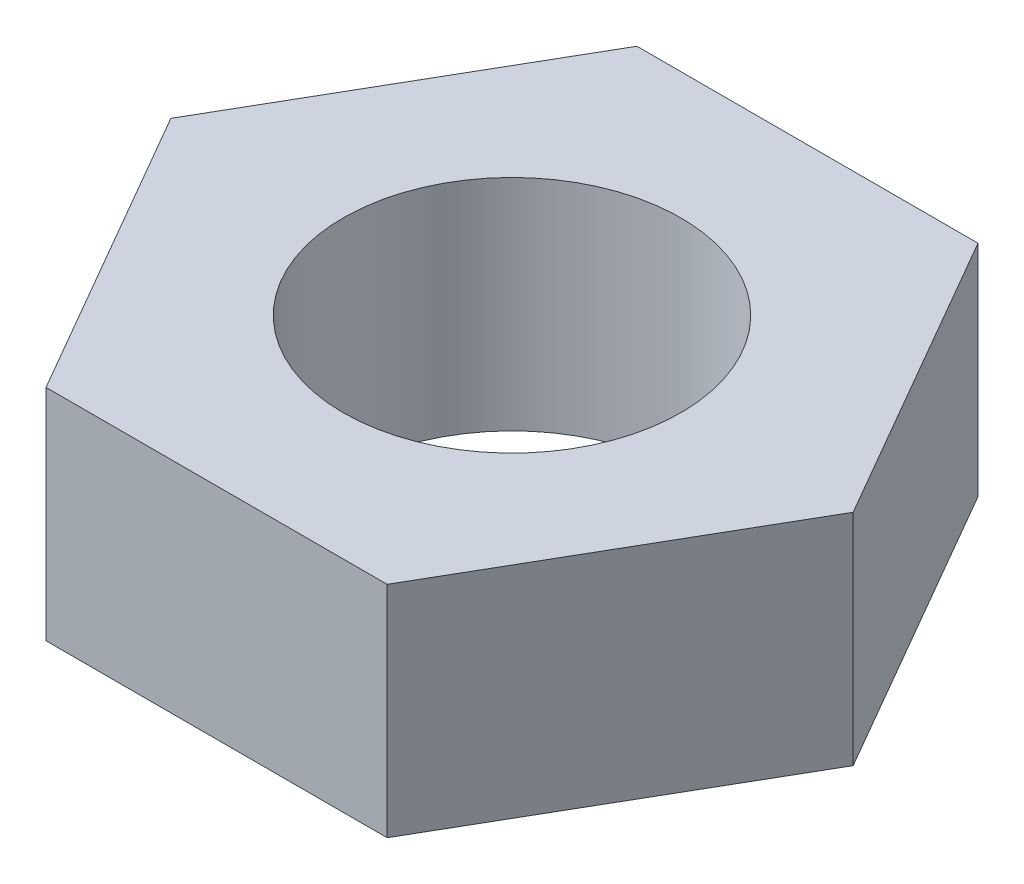
ISO-10303-21;
HEADER;
FILE_DESCRIPTION(('STEP AP214'),'2;1');
FILE_NAME('part.step','',(''),(''),'','','');
FILE_SCHEMA(('AUTOMOTIVE_DESIGN { 1 0 10303 214 1 1 1 1 }'));
ENDSEC;
DATA;
#1=APPLICATION_CONTEXT('core data for automotive mechanical design processes');
#2=APPLICATION_PROTOCOL_DEFINITION('international standard','automotive_design',2000,#1);
#3=PRODUCT_CONTEXT('',#1,'mechanical');
#4=PRODUCT('Part','Part','',(#3));
#5=PRODUCT_RELATED_PRODUCT_CATEGORY('part','',(#4));
#6=PRODUCT_DEFINITION_FORMATION('','',#4);
#7=PRODUCT_DEFINITION_CONTEXT('part definition',#1,'design');
#8=PRODUCT_DEFINITION('design','',#6,#7);
#9=PRODUCT_DEFINITION_SHAPE('','',#8);
#10=(LENGTH_UNIT() NAMED_UNIT(*) SI_UNIT(.MILLI.,.METRE.));
#11=(NAMED_UNIT(*) PLANE_ANGLE_UNIT() SI_UNIT($,.RADIAN.));
#12=(NAMED_UNIT(*) SI_UNIT($,.STERADIAN.) SOLID_ANGLE_UNIT());
#13=UNCERTAINTY_MEASURE_WITH_UNIT(LENGTH_MEASURE(1.E-05),#10,'distance_accuracy_value','');
#14=(GEOMETRIC_REPRESENTATION_CONTEXT(3) GLOBAL_UNCERTAINTY_ASSIGNED_CONTEXT((#13)) GLOBAL_UNIT_ASSIGNED_CONTEXT((#10,
#11,#12)) REPRESENTATION_CONTEXT('',''));
#15=CARTESIAN_POINT('',(0.,0.,0.));
#16=DIRECTION('',(0.,0.,1.));
#17=DIRECTION('',(1.,0.,0.));
#18=AXIS2_PLACEMENT_3D('',#15,#16,#17);
#19=CARTESIAN_POINT('',(0.,2.6,0.));
#20=DIRECTION('',(0.,1.,0.));
#21=DIRECTION('',(0.,0.,1.));
#22=AXIS2_PLACEMENT_3D('',#19,#20,#21);
#23=PLANE('',#22);
#24=DIRECTION('',(0.5,0.,-0.866025403784439));
#25=VECTOR('',#24,1.);
#26=CARTESIAN_POINT('',(2.02072594216369,2.6,3.5));
#27=LINE('',#26,#25);
#28=CARTESIAN_POINT('',(2.02072594216369,2.6,3.5));
#29=VERTEX_POINT('',#28);
#30=CARTESIAN_POINT('',(4.04145188432738,2.6,0.));
#31=VERTEX_POINT('',#30);
#32=EDGE_CURVE('E129',#29,#31,#27,.T.);
#33=ORIENTED_EDGE('',*,*,#32,.T.);
#34=DIRECTION('',(-0.5,0.,-0.866025403784439));
#35=VECTOR('',#34,1.);
#36=CARTESIAN_POINT('',(4.04145188432738,2.6,0.));
#37=LINE('',#36,#35);
#38=CARTESIAN_POINT('',(2.02072594216368,2.6,-3.50000000000001));
#39=VERTEX_POINT('',#38);
#40=EDGE_CURVE('E87',#31,#39,#37,.T.);
#41=ORIENTED_EDGE('',*,*,#40,.T.);
#42=DIRECTION('',(-1.,0.,0.));
#43=VECTOR('',#42,1.);
#44=CARTESIAN_POINT('',(2.02072594216368,2.6,-3.50000000000001));
#45=LINE('',#44,#43);
#46=CARTESIAN_POINT('',(-2.02072594216369,2.6,-3.50000000000001));
#47=VERTEX_POINT('',#46);
#48=EDGE_CURVE('E100',#39,#47,#45,.T.);
#49=ORIENTED_EDGE('',*,*,#48,.T.);
#50=DIRECTION('',(-0.5,0.,0.866025403784439));
#51=VECTOR('',#50,1.);
#52=CARTESIAN_POINT('',(-2.02072594216369,2.6,-3.50000000000001));
#53=LINE('',#52,#51);
#54=CARTESIAN_POINT('',(-4.04145188432739,2.6,0.));
#55=VERTEX_POINT('',#54);
#56=EDGE_CURVE('E94',#47,#55,#53,.T.);
#57=ORIENTED_EDGE('',*,*,#56,.T.);
#58=DIRECTION('',(0.5,0.,0.866025403784439));
#59=VECTOR('',#58,1.);
#60=CARTESIAN_POINT('',(-4.04145188432739,2.6,0.));
#61=LINE('',#60,#59);
#62=CARTESIAN_POINT('',(-2.02072594216369,2.6,3.5));
#63=VERTEX_POINT('',#62);
#64=EDGE_CURVE('E98',#55,#63,#61,.T.);
#65=ORIENTED_EDGE('',*,*,#64,.T.);
#66=DIRECTION('',(1.,0.,0.));
#67=VECTOR('',#66,1.);
#68=CARTESIAN_POINT('',(-2.02072594216369,2.6,3.5));
#69=LINE('',#68,#67);
#70=EDGE_CURVE('E50',#63,#29,#69,.T.);
#71=ORIENTED_EDGE('',*,*,#70,.T.);
#72=EDGE_LOOP('',(#33,#41,#49,#57,#65,#71));
#73=FACE_BOUND('',#72,.T.);
#74=CARTESIAN_POINT('',(0.,2.6,0.));
#75=DIRECTION('',(0.,1.,0.));
#76=DIRECTION('',(0.,0.,1.));
#77=AXIS2_PLACEMENT_3D('',#74,#75,#76);
#78=CIRCLE('',#77,2.);
#79=CARTESIAN_POINT('',(0.,2.6,2.));
#80=VERTEX_POINT('',#79);
#81=EDGE_CURVE('E122',#80,#80,#78,.T.);
#82=ORIENTED_EDGE('',*,*,#81,.F.);
#83=EDGE_LOOP('',(#82));
#84=FACE_BOUND('',#83,.T.);
#85=ADVANCED_FACE('F33',(#73,#84),#23,.T.);
#86=CARTESIAN_POINT('',(0.,0.,0.));
#87=DIRECTION('',(0.,1.,0.));
#88=DIRECTION('',(0.,0.,1.));
#89=AXIS2_PLACEMENT_3D('',#86,#87,#88);
#90=PLANE('',#89);
#91=DIRECTION('',(0.5,0.,-0.866025403784439));
#92=VECTOR('',#91,1.);
#93=CARTESIAN_POINT('',(2.02072594216369,0.,3.5));
#94=LINE('',#93,#92);
#95=CARTESIAN_POINT('',(2.02072594216369,0.,3.5));
#96=VERTEX_POINT('',#95);
#97=CARTESIAN_POINT('',(4.04145188432738,0.,0.));
#98=VERTEX_POINT('',#97);
#99=EDGE_CURVE('E118',#96,#98,#94,.T.);
#100=ORIENTED_EDGE('',*,*,#99,.F.);
#101=DIRECTION('',(1.,0.,0.));
#102=VECTOR('',#101,1.);
#103=CARTESIAN_POINT('',(-2.02072594216369,0.,3.5));
#104=LINE('',#103,#102);
#105=CARTESIAN_POINT('',(-2.02072594216369,0.,3.5));
#106=VERTEX_POINT('',#105);
#107=EDGE_CURVE('E79',#106,#96,#104,.T.);
#108=ORIENTED_EDGE('',*,*,#107,.F.);
#109=DIRECTION('',(0.5,0.,0.866025403784439));
#110=VECTOR('',#109,1.);
#111=CARTESIAN_POINT('',(-4.04145188432739,0.,0.));
#112=LINE('',#111,#110);
#113=CARTESIAN_POINT('',(-4.04145188432739,0.,0.));
#114=VERTEX_POINT('',#113);
#115=EDGE_CURVE('E73',#114,#106,#112,.T.);
#116=ORIENTED_EDGE('',*,*,#115,.F.);
#117=DIRECTION('',(-0.5,0.,0.866025403784439));
#118=VECTOR('',#117,1.);
#119=CARTESIAN_POINT('',(-2.02072594216369,0.,-3.50000000000001));
#120=LINE('',#119,#118);
#121=CARTESIAN_POINT('',(-2.02072594216369,0.,-3.50000000000001));
#122=VERTEX_POINT('',#121);
#123=EDGE_CURVE('E108',#122,#114,#120,.T.);
#124=ORIENTED_EDGE('',*,*,#123,.F.);
#125=DIRECTION('',(-1.,0.,0.));
#126=VECTOR('',#125,1.);
#127=CARTESIAN_POINT('',(2.02072594216368,0.,-3.50000000000001));
#128=LINE('',#127,#126);
#129=CARTESIAN_POINT('',(2.02072594216368,0.,-3.50000000000001));
#130=VERTEX_POINT('',#129);
#131=EDGE_CURVE('E124',#130,#122,#128,.T.);
#132=ORIENTED_EDGE('',*,*,#131,.F.);
#133=DIRECTION('',(-0.5,0.,-0.866025403784439));
#134=VECTOR('',#133,1.);
#135=CARTESIAN_POINT('',(4.04145188432738,0.,0.));
#136=LINE('',#135,#134);
#137=EDGE_CURVE('E121',#98,#130,#136,.T.);
#138=ORIENTED_EDGE('',*,*,#137,.F.);
#139=EDGE_LOOP('',(#100,#108,#116,#124,#132,#138));
#140=FACE_BOUND('',#139,.T.);
#141=CARTESIAN_POINT('',(0.,0.,0.));
#142=DIRECTION('',(0.,1.,0.));
#143=DIRECTION('',(0.,0.,1.));
#144=AXIS2_PLACEMENT_3D('',#141,#142,#143);
#145=CIRCLE('',#144,2.);
#146=CARTESIAN_POINT('',(0.,0.,2.));
#147=VERTEX_POINT('',#146);
#148=EDGE_CURVE('E222',#147,#147,#145,.T.);
#149=ORIENTED_EDGE('',*,*,#148,.T.);
#150=EDGE_LOOP('',(#149));
#151=FACE_BOUND('',#150,.T.);
#152=ADVANCED_FACE('F138',(#140,#151),#90,.F.);
#153=CARTESIAN_POINT('',(2.02072594216369,2.6,3.5));
#154=DIRECTION('',(-0.866025403784439,0.,-0.5));
#155=DIRECTION('',(-0.5,0.,0.866025403784439));
#156=AXIS2_PLACEMENT_3D('',#153,#154,#155);
#157=PLANE('',#156);
#158=ORIENTED_EDGE('',*,*,#99,.T.);
#159=DIRECTION('',(0.,-1.,0.));
#160=VECTOR('',#159,1.);
#161=CARTESIAN_POINT('',(4.04145188432738,2.6,0.));
#162=LINE('',#161,#160);
#163=EDGE_CURVE('E11',#31,#98,#162,.T.);
#164=ORIENTED_EDGE('',*,*,#163,.F.);
#165=ORIENTED_EDGE('',*,*,#32,.F.);
#166=DIRECTION('',(0.,-1.,0.));
#167=VECTOR('',#166,1.);
#168=CARTESIAN_POINT('',(2.02072594216369,2.6,3.5));
#169=LINE('',#168,#167);
#170=EDGE_CURVE('E114',#29,#96,#169,.T.);
#171=ORIENTED_EDGE('',*,*,#170,.T.);
#172=EDGE_LOOP('',(#158,#164,#165,#171));
#173=FACE_BOUND('',#172,.T.);
#174=ADVANCED_FACE('F35',(#173),#157,.F.);
#175=CARTESIAN_POINT('',(4.04145188432738,2.6,0.));
#176=DIRECTION('',(-0.866025403784439,0.,0.5));
#177=DIRECTION('',(0.5,0.,0.866025403784439));
#178=AXIS2_PLACEMENT_3D('',#175,#176,#177);
#179=PLANE('',#178);
#180=ORIENTED_EDGE('',*,*,#137,.T.);
#181=DIRECTION('',(0.,-1.,0.));
#182=VECTOR('',#181,1.);
#183=CARTESIAN_POINT('',(2.02072594216368,2.6,-3.50000000000001));
#184=LINE('',#183,#182);
#185=EDGE_CURVE('E42',#39,#130,#184,.T.);
#186=ORIENTED_EDGE('',*,*,#185,.F.);
#187=ORIENTED_EDGE('',*,*,#40,.F.);
#188=ORIENTED_EDGE('',*,*,#163,.T.);
#189=EDGE_LOOP('',(#180,#186,#187,#188));
#190=FACE_BOUND('',#189,.T.);
#191=ADVANCED_FACE('F163',(#190),#179,.F.);
#192=CARTESIAN_POINT('',(2.02072594216368,2.6,-3.50000000000001));
#193=DIRECTION('',(0.,0.,1.));
#194=DIRECTION('',(1.,0.,0.));
#195=AXIS2_PLACEMENT_3D('',#192,#193,#194);
#196=PLANE('',#195);
#197=ORIENTED_EDGE('',*,*,#131,.T.);
#198=DIRECTION('',(0.,-1.,0.));
#199=VECTOR('',#198,1.);
#200=CARTESIAN_POINT('',(-2.02072594216369,2.6,-3.50000000000001));
#201=LINE('',#200,#199);
#202=EDGE_CURVE('E109',#47,#122,#201,.T.);
#203=ORIENTED_EDGE('',*,*,#202,.F.);
#204=ORIENTED_EDGE('',*,*,#48,.F.);
#205=ORIENTED_EDGE('',*,*,#185,.T.);
#206=EDGE_LOOP('',(#197,#203,#204,#205));
#207=FACE_BOUND('',#206,.T.);
#208=ADVANCED_FACE('F135',(#207),#196,.F.);
#209=CARTESIAN_POINT('',(-2.02072594216369,2.6,-3.50000000000001));
#210=DIRECTION('',(0.866025403784439,0.,0.5));
#211=DIRECTION('',(0.5,0.,-0.866025403784439));
#212=AXIS2_PLACEMENT_3D('',#209,#210,#211);
#213=PLANE('',#212);
#214=ORIENTED_EDGE('',*,*,#123,.T.);
#215=DIRECTION('',(0.,-1.,0.));
#216=VECTOR('',#215,1.);
#217=CARTESIAN_POINT('',(-4.04145188432739,2.6,0.));
#218=LINE('',#217,#216);
#219=EDGE_CURVE('E105',#55,#114,#218,.T.);
#220=ORIENTED_EDGE('',*,*,#219,.F.);
#221=ORIENTED_EDGE('',*,*,#56,.F.);
#222=ORIENTED_EDGE('',*,*,#202,.T.);
#223=EDGE_LOOP('',(#214,#220,#221,#222));
#224=FACE_BOUND('',#223,.T.);
#225=ADVANCED_FACE('F106',(#224),#213,.F.);
#226=CARTESIAN_POINT('',(-4.04145188432739,2.6,0.));
#227=DIRECTION('',(0.866025403784439,0.,-0.5));
#228=DIRECTION('',(-0.5,0.,-0.866025403784439));
#229=AXIS2_PLACEMENT_3D('',#226,#227,#228);
#230=PLANE('',#229);
#231=ORIENTED_EDGE('',*,*,#115,.T.);
#232=DIRECTION('',(0.,-1.,0.));
#233=VECTOR('',#232,1.);
#234=CARTESIAN_POINT('',(-2.02072594216369,2.6,3.5));
#235=LINE('',#234,#233);
#236=EDGE_CURVE('E110',#63,#106,#235,.T.);
#237=ORIENTED_EDGE('',*,*,#236,.F.);
#238=ORIENTED_EDGE('',*,*,#64,.F.);
#239=ORIENTED_EDGE('',*,*,#219,.T.);
#240=EDGE_LOOP('',(#231,#237,#238,#239));
#241=FACE_BOUND('',#240,.T.);
#242=ADVANCED_FACE('F112',(#241),#230,.F.);
#243=CARTESIAN_POINT('',(-2.02072594216369,2.6,3.5));
#244=DIRECTION('',(0.,0.,-1.));
#245=DIRECTION('',(-1.,0.,0.));
#246=AXIS2_PLACEMENT_3D('',#243,#244,#245);
#247=PLANE('',#246);
#248=ORIENTED_EDGE('',*,*,#107,.T.);
#249=ORIENTED_EDGE('',*,*,#170,.F.);
#250=ORIENTED_EDGE('',*,*,#70,.F.);
#251=ORIENTED_EDGE('',*,*,#236,.T.);
#252=EDGE_LOOP('',(#248,#249,#250,#251));
#253=FACE_BOUND('',#252,.T.);
#254=ADVANCED_FACE('F143',(#253),#247,.F.);
#255=CARTESIAN_POINT('',(0.,2.6,0.));
#256=DIRECTION('',(0.,-1.,0.));
#257=DIRECTION('',(0.,0.,-1.));
#258=AXIS2_PLACEMENT_3D('',#255,#256,#257);
#259=CYLINDRICAL_SURFACE('',#258,2.);
#260=ORIENTED_EDGE('',*,*,#81,.T.);
#261=EDGE_LOOP('',(#260));
#262=FACE_BOUND('',#261,.T.);
#263=ORIENTED_EDGE('',*,*,#148,.F.);
#264=EDGE_LOOP('',(#263));
#265=FACE_BOUND('',#264,.T.);
#266=ADVANCED_FACE('F145',(#262,#265),#259,.F.);
#267=CLOSED_SHELL('',(#85,#152,#174,#191,#208,#225,#242,#254,#266));
#268=MANIFOLD_SOLID_BREP('B2',#267);
#269=ADVANCED_BREP_SHAPE_REPRESENTATION('',(#18,#268),#14);
#270=SHAPE_DEFINITION_REPRESENTATION(#9,#269);
ENDSEC;
END-ISO-10303-21;
